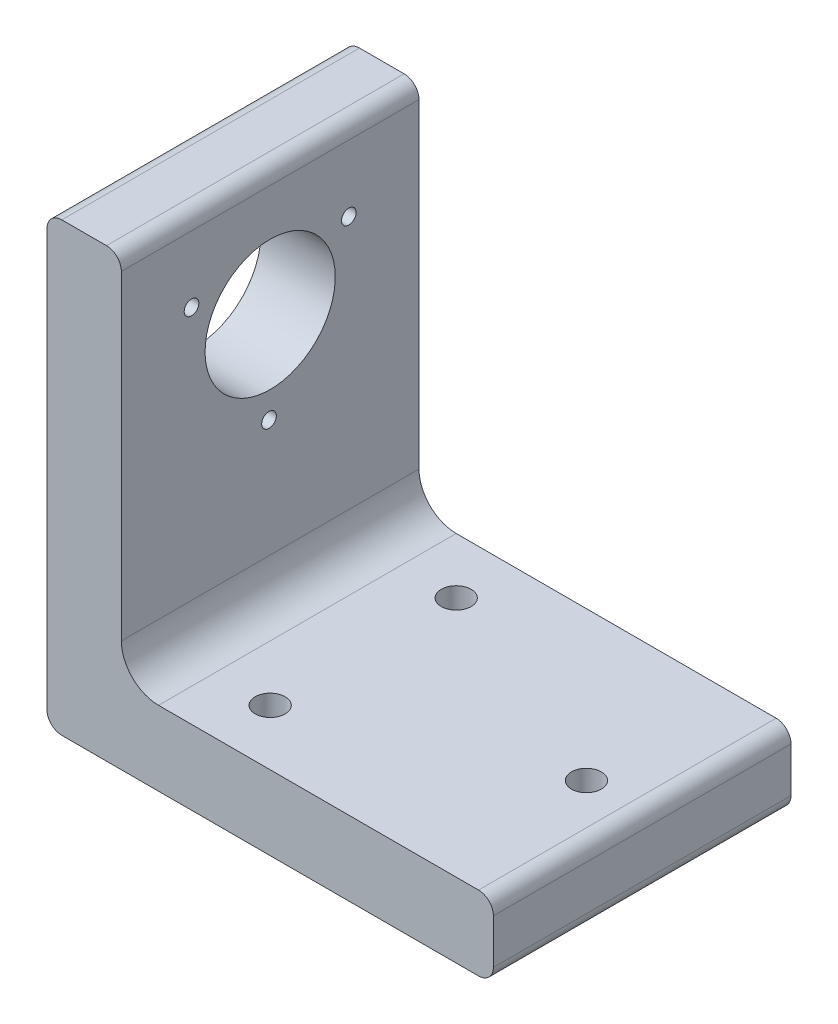
ISO-10303-21;
HEADER;
FILE_DESCRIPTION(('STEP AP214'),'2;1');
FILE_NAME('part.step','',(''),(''),'','','');
FILE_SCHEMA(('AUTOMOTIVE_DESIGN { 1 0 10303 214 1 1 1 1 }'));
ENDSEC;
DATA;
#1=APPLICATION_CONTEXT('core data for automotive mechanical design processes');
#2=APPLICATION_PROTOCOL_DEFINITION('international standard','automotive_design',2000,#1);
#3=PRODUCT_CONTEXT('',#1,'mechanical');
#4=PRODUCT('Part','Part','',(#3));
#5=PRODUCT_RELATED_PRODUCT_CATEGORY('part','',(#4));
#6=PRODUCT_DEFINITION_FORMATION('','',#4);
#7=PRODUCT_DEFINITION_CONTEXT('part definition',#1,'design');
#8=PRODUCT_DEFINITION('design','',#6,#7);
#9=PRODUCT_DEFINITION_SHAPE('','',#8);
#10=(LENGTH_UNIT() NAMED_UNIT(*) SI_UNIT(.MILLI.,.METRE.));
#11=(NAMED_UNIT(*) PLANE_ANGLE_UNIT() SI_UNIT($,.RADIAN.));
#12=(NAMED_UNIT(*) SI_UNIT($,.STERADIAN.) SOLID_ANGLE_UNIT());
#13=UNCERTAINTY_MEASURE_WITH_UNIT(LENGTH_MEASURE(1.E-05),#10,'distance_accuracy_value','');
#14=(GEOMETRIC_REPRESENTATION_CONTEXT(3) GLOBAL_UNCERTAINTY_ASSIGNED_CONTEXT((#13)) GLOBAL_UNIT_ASSIGNED_CONTEXT((#10,
#11,#12)) REPRESENTATION_CONTEXT('',''));
#15=CARTESIAN_POINT('',(0.,0.,0.));
#16=DIRECTION('',(0.,0.,1.));
#17=DIRECTION('',(1.,0.,0.));
#18=AXIS2_PLACEMENT_3D('',#15,#16,#17);
#19=CARTESIAN_POINT('',(12.7,12.7,50.8));
#20=DIRECTION('',(0.,-1.,0.));
#21=DIRECTION('',(1.,0.,0.));
#22=AXIS2_PLACEMENT_3D('',#19,#20,#21);
#23=PLANE('',#22);
#24=DIRECTION('',(-1.,0.,0.));
#25=VECTOR('',#24,1.);
#26=CARTESIAN_POINT('',(12.7,12.7,0.));
#27=LINE('',#26,#25);
#28=CARTESIAN_POINT('',(73.66,12.7,0.));
#29=VERTEX_POINT('',#28);
#30=CARTESIAN_POINT('',(19.05,12.7,0.));
#31=VERTEX_POINT('',#30);
#32=EDGE_CURVE('E169',#29,#31,#27,.T.);
#33=ORIENTED_EDGE('',*,*,#32,.T.);
#34=DIRECTION('',(0.,0.,-1.));
#35=VECTOR('',#34,1.);
#36=CARTESIAN_POINT('',(19.05,12.7,50.8));
#37=LINE('',#36,#35);
#38=CARTESIAN_POINT('',(19.05,12.7,50.8));
#39=VERTEX_POINT('',#38);
#40=EDGE_CURVE('E66',#31,#39,#37,.F.);
#41=ORIENTED_EDGE('',*,*,#40,.T.);
#42=DIRECTION('',(-1.,0.,0.));
#43=VECTOR('',#42,1.);
#44=CARTESIAN_POINT('',(12.7,12.7,50.8));
#45=LINE('',#44,#43);
#46=CARTESIAN_POINT('',(73.66,12.7,50.8));
#47=VERTEX_POINT('',#46);
#48=EDGE_CURVE('E242',#47,#39,#45,.T.);
#49=ORIENTED_EDGE('',*,*,#48,.F.);
#50=DIRECTION('',(0.,0.,-1.));
#51=VECTOR('',#50,1.);
#52=CARTESIAN_POINT('',(73.66,12.7,50.8));
#53=LINE('',#52,#51);
#54=EDGE_CURVE('E224',#47,#29,#53,.T.);
#55=ORIENTED_EDGE('',*,*,#54,.T.);
#56=EDGE_LOOP('',(#33,#41,#49,#55));
#57=FACE_BOUND('',#56,.T.);
#58=CARTESIAN_POINT('',(66.675,12.7,25.4));
#59=DIRECTION('',(0.,1.,0.));
#60=DIRECTION('',(0.,0.,1.));
#61=AXIS2_PLACEMENT_3D('',#58,#59,#60);
#62=CIRCLE('',#61,2.55270000000001);
#63=CARTESIAN_POINT('',(66.675,12.7,27.9527));
#64=VERTEX_POINT('',#63);
#65=EDGE_CURVE('E561',#64,#64,#62,.T.);
#66=ORIENTED_EDGE('',*,*,#65,.F.);
#67=EDGE_LOOP('',(#66));
#68=FACE_BOUND('',#67,.T.);
#69=CARTESIAN_POINT('',(28.575,12.7,41.275));
#70=DIRECTION('',(0.,1.,0.));
#71=DIRECTION('',(0.,0.,1.));
#72=AXIS2_PLACEMENT_3D('',#69,#70,#71);
#73=CIRCLE('',#72,2.5527);
#74=CARTESIAN_POINT('',(28.575,12.7,43.8277));
#75=VERTEX_POINT('',#74);
#76=EDGE_CURVE('E551',#75,#75,#73,.T.);
#77=ORIENTED_EDGE('',*,*,#76,.F.);
#78=EDGE_LOOP('',(#77));
#79=FACE_BOUND('',#78,.T.);
#80=CARTESIAN_POINT('',(28.575,12.7,9.52500000000001));
#81=DIRECTION('',(0.,1.,0.));
#82=DIRECTION('',(0.,0.,1.));
#83=AXIS2_PLACEMENT_3D('',#80,#81,#82);
#84=CIRCLE('',#83,2.5527);
#85=CARTESIAN_POINT('',(28.575,12.7,12.0777));
#86=VERTEX_POINT('',#85);
#87=EDGE_CURVE('E546',#86,#86,#84,.T.);
#88=ORIENTED_EDGE('',*,*,#87,.F.);
#89=EDGE_LOOP('',(#88));
#90=FACE_BOUND('',#89,.T.);
#91=ADVANCED_FACE('F44',(#57,#68,#79,#90),#23,.F.);
#92=CARTESIAN_POINT('',(12.7,76.2,50.8));
#93=DIRECTION('',(-1.,0.,0.));
#94=DIRECTION('',(0.,-1.,0.));
#95=AXIS2_PLACEMENT_3D('',#92,#93,#94);
#96=PLANE('',#95);
#97=CARTESIAN_POINT('',(12.7,62.3600000000001,11.9766062413412));
#98=DIRECTION('',(1.,0.,0.));
#99=DIRECTION('',(0.,0.,-1.));
#100=AXIS2_PLACEMENT_3D('',#97,#98,#99);
#101=CIRCLE('',#100,1.25);
#102=CARTESIAN_POINT('',(12.7,62.3600000000001,10.7266062413412));
#103=VERTEX_POINT('',#102);
#104=EDGE_CURVE('E577',#103,#103,#101,.T.);
#105=ORIENTED_EDGE('',*,*,#104,.F.);
#106=EDGE_LOOP('',(#105));
#107=FACE_BOUND('',#106,.T.);
#108=CARTESIAN_POINT('',(12.7,54.61,25.4));
#109=DIRECTION('',(1.,0.,0.));
#110=DIRECTION('',(0.,1.,0.));
#111=AXIS2_PLACEMENT_3D('',#108,#109,#110);
#112=CIRCLE('',#111,11.1125);
#113=CARTESIAN_POINT('',(12.7,65.7225,25.4));
#114=VERTEX_POINT('',#113);
#115=EDGE_CURVE('E256',#114,#114,#112,.T.);
#116=ORIENTED_EDGE('',*,*,#115,.F.);
#117=EDGE_LOOP('',(#116));
#118=FACE_BOUND('',#117,.T.);
#119=DIRECTION('',(0.,1.,0.));
#120=VECTOR('',#119,1.);
#121=CARTESIAN_POINT('',(12.7,76.2,50.8));
#122=LINE('',#121,#120);
#123=CARTESIAN_POINT('',(12.7,19.05,50.8));
#124=VERTEX_POINT('',#123);
#125=CARTESIAN_POINT('',(12.7,73.66,50.8));
#126=VERTEX_POINT('',#125);
#127=EDGE_CURVE('E239',#124,#126,#122,.T.);
#128=ORIENTED_EDGE('',*,*,#127,.F.);
#129=DIRECTION('',(0.,0.,-1.));
#130=VECTOR('',#129,1.);
#131=CARTESIAN_POINT('',(12.7,19.05,0.));
#132=LINE('',#131,#130);
#133=CARTESIAN_POINT('',(12.7,19.05,0.));
#134=VERTEX_POINT('',#133);
#135=EDGE_CURVE('E228',#124,#134,#132,.T.);
#136=ORIENTED_EDGE('',*,*,#135,.T.);
#137=DIRECTION('',(0.,1.,0.));
#138=VECTOR('',#137,1.);
#139=CARTESIAN_POINT('',(12.7,76.2,0.));
#140=LINE('',#139,#138);
#141=CARTESIAN_POINT('',(12.7,73.66,0.));
#142=VERTEX_POINT('',#141);
#143=EDGE_CURVE('E162',#134,#142,#140,.T.);
#144=ORIENTED_EDGE('',*,*,#143,.T.);
#145=DIRECTION('',(0.,0.,-1.));
#146=VECTOR('',#145,1.);
#147=CARTESIAN_POINT('',(12.7,73.66,50.8));
#148=LINE('',#147,#146);
#149=EDGE_CURVE('E141',#142,#126,#148,.F.);
#150=ORIENTED_EDGE('',*,*,#149,.T.);
#151=EDGE_LOOP('',(#128,#136,#144,#150));
#152=FACE_BOUND('',#151,.T.);
#153=CARTESIAN_POINT('',(12.7,39.1113092810381,25.6014596683332));
#154=DIRECTION('',(1.,0.,0.));
#155=DIRECTION('',(0.,0.,-1.));
#156=AXIS2_PLACEMENT_3D('',#153,#154,#155);
#157=CIRCLE('',#156,1.25);
#158=CARTESIAN_POINT('',(12.7,39.1113092810381,24.3514596683332));
#159=VERTEX_POINT('',#158);
#160=EDGE_CURVE('E585',#159,#159,#157,.T.);
#161=ORIENTED_EDGE('',*,*,#160,.F.);
#162=EDGE_LOOP('',(#161));
#163=FACE_BOUND('',#162,.T.);
#164=CARTESIAN_POINT('',(12.7,62.36,38.8233937586588));
#165=DIRECTION('',(1.,0.,0.));
#166=DIRECTION('',(0.,0.,-1.));
#167=AXIS2_PLACEMENT_3D('',#164,#165,#166);
#168=CIRCLE('',#167,1.25);
#169=CARTESIAN_POINT('',(12.7,62.36,37.5733937586588));
#170=VERTEX_POINT('',#169);
#171=EDGE_CURVE('E569',#170,#170,#168,.T.);
#172=ORIENTED_EDGE('',*,*,#171,.F.);
#173=EDGE_LOOP('',(#172));
#174=FACE_BOUND('',#173,.T.);
#175=ADVANCED_FACE('F276',(#107,#118,#152,#163,#174),#96,.F.);
#176=CARTESIAN_POINT('',(76.2,0.,50.8));
#177=DIRECTION('',(0.,1.,0.));
#178=DIRECTION('',(0.,0.,1.));
#179=AXIS2_PLACEMENT_3D('',#176,#177,#178);
#180=PLANE('',#179);
#181=CARTESIAN_POINT('',(28.575,0.,9.52500000000001));
#182=DIRECTION('',(0.,1.,0.));
#183=DIRECTION('',(0.,0.,1.));
#184=AXIS2_PLACEMENT_3D('',#181,#182,#183);
#185=CIRCLE('',#184,2.5527);
#186=CARTESIAN_POINT('',(28.575,0.,12.0777));
#187=VERTEX_POINT('',#186);
#188=EDGE_CURVE('E543',#187,#187,#185,.T.);
#189=ORIENTED_EDGE('',*,*,#188,.T.);
#190=EDGE_LOOP('',(#189));
#191=FACE_BOUND('',#190,.T.);
#192=CARTESIAN_POINT('',(28.575,0.,41.275));
#193=DIRECTION('',(0.,1.,0.));
#194=DIRECTION('',(0.,0.,1.));
#195=AXIS2_PLACEMENT_3D('',#192,#193,#194);
#196=CIRCLE('',#195,2.5527);
#197=CARTESIAN_POINT('',(28.575,0.,43.8277));
#198=VERTEX_POINT('',#197);
#199=EDGE_CURVE('E557',#198,#198,#196,.T.);
#200=ORIENTED_EDGE('',*,*,#199,.T.);
#201=EDGE_LOOP('',(#200));
#202=FACE_BOUND('',#201,.T.);
#203=CARTESIAN_POINT('',(66.675,0.,25.4));
#204=DIRECTION('',(0.,1.,0.));
#205=DIRECTION('',(0.,0.,1.));
#206=AXIS2_PLACEMENT_3D('',#203,#204,#205);
#207=CIRCLE('',#206,2.5527);
#208=CARTESIAN_POINT('',(66.675,0.,27.9527));
#209=VERTEX_POINT('',#208);
#210=EDGE_CURVE('E565',#209,#209,#207,.T.);
#211=ORIENTED_EDGE('',*,*,#210,.T.);
#212=EDGE_LOOP('',(#211));
#213=FACE_BOUND('',#212,.T.);
#214=DIRECTION('',(1.,0.,0.));
#215=VECTOR('',#214,1.);
#216=CARTESIAN_POINT('',(76.2,0.,50.8));
#217=LINE('',#216,#215);
#218=CARTESIAN_POINT('',(2.54000000000003,0.,50.8));
#219=VERTEX_POINT('',#218);
#220=CARTESIAN_POINT('',(73.66,0.,50.8));
#221=VERTEX_POINT('',#220);
#222=EDGE_CURVE('E167',#219,#221,#217,.T.);
#223=ORIENTED_EDGE('',*,*,#222,.F.);
#224=DIRECTION('',(0.,0.,-1.));
#225=VECTOR('',#224,1.);
#226=CARTESIAN_POINT('',(2.54,0.,50.8));
#227=LINE('',#226,#225);
#228=CARTESIAN_POINT('',(2.54000000000003,0.,0.));
#229=VERTEX_POINT('',#228);
#230=EDGE_CURVE('E213',#219,#229,#227,.T.);
#231=ORIENTED_EDGE('',*,*,#230,.T.);
#232=DIRECTION('',(1.,0.,0.));
#233=VECTOR('',#232,1.);
#234=CARTESIAN_POINT('',(76.2,0.,0.));
#235=LINE('',#234,#233);
#236=CARTESIAN_POINT('',(73.66,0.,0.));
#237=VERTEX_POINT('',#236);
#238=EDGE_CURVE('E259',#229,#237,#235,.T.);
#239=ORIENTED_EDGE('',*,*,#238,.T.);
#240=DIRECTION('',(0.,0.,-1.));
#241=VECTOR('',#240,1.);
#242=CARTESIAN_POINT('',(73.66,0.,50.8));
#243=LINE('',#242,#241);
#244=EDGE_CURVE('E210',#237,#221,#243,.F.);
#245=ORIENTED_EDGE('',*,*,#244,.T.);
#246=EDGE_LOOP('',(#223,#231,#239,#245));
#247=FACE_BOUND('',#246,.T.);
#248=ADVANCED_FACE('F292',(#191,#202,#213,#247),#180,.F.);
#249=CARTESIAN_POINT('',(76.2,12.7,50.8));
#250=DIRECTION('',(-1.,0.,0.));
#251=DIRECTION('',(0.,0.,1.));
#252=AXIS2_PLACEMENT_3D('',#249,#250,#251);
#253=PLANE('',#252);
#254=DIRECTION('',(0.,1.,0.));
#255=VECTOR('',#254,1.);
#256=CARTESIAN_POINT('',(76.2,12.7,50.8));
#257=LINE('',#256,#255);
#258=CARTESIAN_POINT('',(76.2,2.54,50.8));
#259=VERTEX_POINT('',#258);
#260=CARTESIAN_POINT('',(76.2,10.16,50.8));
#261=VERTEX_POINT('',#260);
#262=EDGE_CURVE('E245',#259,#261,#257,.T.);
#263=ORIENTED_EDGE('',*,*,#262,.F.);
#264=DIRECTION('',(0.,0.,-1.));
#265=VECTOR('',#264,1.);
#266=CARTESIAN_POINT('',(76.2,2.54,50.8));
#267=LINE('',#266,#265);
#268=CARTESIAN_POINT('',(76.2,2.54,0.));
#269=VERTEX_POINT('',#268);
#270=EDGE_CURVE('E220',#259,#269,#267,.T.);
#271=ORIENTED_EDGE('',*,*,#270,.T.);
#272=DIRECTION('',(0.,1.,0.));
#273=VECTOR('',#272,1.);
#274=CARTESIAN_POINT('',(76.2,12.7,0.));
#275=LINE('',#274,#273);
#276=CARTESIAN_POINT('',(76.2,10.16,0.));
#277=VERTEX_POINT('',#276);
#278=EDGE_CURVE('E263',#269,#277,#275,.T.);
#279=ORIENTED_EDGE('',*,*,#278,.T.);
#280=DIRECTION('',(0.,0.,-1.));
#281=VECTOR('',#280,1.);
#282=CARTESIAN_POINT('',(76.2,10.16,50.8));
#283=LINE('',#282,#281);
#284=EDGE_CURVE('E217',#277,#261,#283,.F.);
#285=ORIENTED_EDGE('',*,*,#284,.T.);
#286=EDGE_LOOP('',(#263,#271,#279,#285));
#287=FACE_BOUND('',#286,.T.);
#288=ADVANCED_FACE('F300',(#287),#253,.F.);
#289=CARTESIAN_POINT('',(0.,76.2,50.8));
#290=DIRECTION('',(0.,-1.,0.));
#291=DIRECTION('',(0.,0.,-1.));
#292=AXIS2_PLACEMENT_3D('',#289,#290,#291);
#293=PLANE('',#292);
#294=DIRECTION('',(-1.,0.,0.));
#295=VECTOR('',#294,1.);
#296=CARTESIAN_POINT('',(0.,76.2,50.8));
#297=LINE('',#296,#295);
#298=CARTESIAN_POINT('',(10.16,76.2,50.8));
#299=VERTEX_POINT('',#298);
#300=CARTESIAN_POINT('',(2.54,76.2,50.8));
#301=VERTEX_POINT('',#300);
#302=EDGE_CURVE('E153',#299,#301,#297,.T.);
#303=ORIENTED_EDGE('',*,*,#302,.F.);
#304=DIRECTION('',(0.,0.,-1.));
#305=VECTOR('',#304,1.);
#306=CARTESIAN_POINT('',(10.16,76.2,50.8));
#307=LINE('',#306,#305);
#308=CARTESIAN_POINT('',(10.16,76.2,0.));
#309=VERTEX_POINT('',#308);
#310=EDGE_CURVE('E139',#299,#309,#307,.T.);
#311=ORIENTED_EDGE('',*,*,#310,.T.);
#312=DIRECTION('',(-1.,0.,0.));
#313=VECTOR('',#312,1.);
#314=CARTESIAN_POINT('',(0.,76.2,0.));
#315=LINE('',#314,#313);
#316=CARTESIAN_POINT('',(2.54,76.2,0.));
#317=VERTEX_POINT('',#316);
#318=EDGE_CURVE('E150',#309,#317,#315,.T.);
#319=ORIENTED_EDGE('',*,*,#318,.T.);
#320=DIRECTION('',(0.,0.,-1.));
#321=VECTOR('',#320,1.);
#322=CARTESIAN_POINT('',(2.54,76.2,50.8));
#323=LINE('',#322,#321);
#324=EDGE_CURVE('E156',#317,#301,#323,.F.);
#325=ORIENTED_EDGE('',*,*,#324,.T.);
#326=EDGE_LOOP('',(#303,#311,#319,#325));
#327=FACE_BOUND('',#326,.T.);
#328=ADVANCED_FACE('F149',(#327),#293,.F.);
#329=CARTESIAN_POINT('',(0.,0.,50.8));
#330=DIRECTION('',(1.,0.,0.));
#331=DIRECTION('',(0.,0.,-1.));
#332=AXIS2_PLACEMENT_3D('',#329,#330,#331);
#333=PLANE('',#332);
#334=CARTESIAN_POINT('',(0.,62.36,38.8233937586588));
#335=DIRECTION('',(1.,0.,0.));
#336=DIRECTION('',(0.,0.,-1.));
#337=AXIS2_PLACEMENT_3D('',#334,#335,#336);
#338=CIRCLE('',#337,1.25);
#339=CARTESIAN_POINT('',(0.,62.36,37.5733937586588));
#340=VERTEX_POINT('',#339);
#341=EDGE_CURVE('E573',#340,#340,#338,.T.);
#342=ORIENTED_EDGE('',*,*,#341,.T.);
#343=EDGE_LOOP('',(#342));
#344=FACE_BOUND('',#343,.T.);
#345=CARTESIAN_POINT('',(0.,62.3600000000001,11.9766062413412));
#346=DIRECTION('',(1.,0.,0.));
#347=DIRECTION('',(0.,0.,-1.));
#348=AXIS2_PLACEMENT_3D('',#345,#346,#347);
#349=CIRCLE('',#348,1.25);
#350=CARTESIAN_POINT('',(0.,62.3600000000001,10.7266062413412));
#351=VERTEX_POINT('',#350);
#352=EDGE_CURVE('E581',#351,#351,#349,.T.);
#353=ORIENTED_EDGE('',*,*,#352,.T.);
#354=EDGE_LOOP('',(#353));
#355=FACE_BOUND('',#354,.T.);
#356=CARTESIAN_POINT('',(0.,39.1113092810381,25.6014596683332));
#357=DIRECTION('',(1.,0.,0.));
#358=DIRECTION('',(0.,0.,-1.));
#359=AXIS2_PLACEMENT_3D('',#356,#357,#358);
#360=CIRCLE('',#359,1.25);
#361=CARTESIAN_POINT('',(0.,39.1113092810381,24.3514596683332));
#362=VERTEX_POINT('',#361);
#363=EDGE_CURVE('E589',#362,#362,#360,.T.);
#364=ORIENTED_EDGE('',*,*,#363,.T.);
#365=EDGE_LOOP('',(#364));
#366=FACE_BOUND('',#365,.T.);
#367=CARTESIAN_POINT('',(0.,54.61,25.4));
#368=DIRECTION('',(1.,0.,0.));
#369=DIRECTION('',(0.,1.,0.));
#370=AXIS2_PLACEMENT_3D('',#367,#368,#369);
#371=CIRCLE('',#370,11.1125);
#372=CARTESIAN_POINT('',(0.,65.7225,25.4));
#373=VERTEX_POINT('',#372);
#374=EDGE_CURVE('E264',#373,#373,#371,.T.);
#375=ORIENTED_EDGE('',*,*,#374,.T.);
#376=EDGE_LOOP('',(#375));
#377=FACE_BOUND('',#376,.T.);
#378=DIRECTION('',(0.,-1.,0.));
#379=VECTOR('',#378,1.);
#380=CARTESIAN_POINT('',(0.,0.,50.8));
#381=LINE('',#380,#379);
#382=CARTESIAN_POINT('',(0.,73.66,50.8));
#383=VERTEX_POINT('',#382);
#384=CARTESIAN_POINT('',(0.,2.54,50.8));
#385=VERTEX_POINT('',#384);
#386=EDGE_CURVE('E174',#383,#385,#381,.T.);
#387=ORIENTED_EDGE('',*,*,#386,.F.);
#388=DIRECTION('',(0.,0.,-1.));
#389=VECTOR('',#388,1.);
#390=CARTESIAN_POINT('',(0.,73.66,50.8));
#391=LINE('',#390,#389);
#392=CARTESIAN_POINT('',(0.,73.66,0.));
#393=VERTEX_POINT('',#392);
#394=EDGE_CURVE('E206',#383,#393,#391,.T.);
#395=ORIENTED_EDGE('',*,*,#394,.T.);
#396=DIRECTION('',(0.,-1.,0.));
#397=VECTOR('',#396,1.);
#398=CARTESIAN_POINT('',(0.,0.,0.));
#399=LINE('',#398,#397);
#400=CARTESIAN_POINT('',(0.,2.54,0.));
#401=VERTEX_POINT('',#400);
#402=EDGE_CURVE('E161',#393,#401,#399,.T.);
#403=ORIENTED_EDGE('',*,*,#402,.T.);
#404=DIRECTION('',(0.,0.,-1.));
#405=VECTOR('',#404,1.);
#406=CARTESIAN_POINT('',(0.,2.54,50.8));
#407=LINE('',#406,#405);
#408=EDGE_CURVE('E203',#401,#385,#407,.F.);
#409=ORIENTED_EDGE('',*,*,#408,.T.);
#410=EDGE_LOOP('',(#387,#395,#403,#409));
#411=FACE_BOUND('',#410,.T.);
#412=ADVANCED_FACE('F284',(#344,#355,#366,#377,#411),#333,.F.);
#413=CARTESIAN_POINT('',(0.,0.,50.8));
#414=DIRECTION('',(0.,0.,-1.));
#415=DIRECTION('',(-1.,0.,0.));
#416=AXIS2_PLACEMENT_3D('',#413,#414,#415);
#417=PLANE('',#416);
#418=ORIENTED_EDGE('',*,*,#48,.T.);
#419=CARTESIAN_POINT('',(19.05,19.05,50.8));
#420=DIRECTION('',(0.,0.,-1.));
#421=DIRECTION('',(-1.,0.,0.));
#422=AXIS2_PLACEMENT_3D('',#419,#420,#421);
#423=CIRCLE('',#422,6.35);
#424=EDGE_CURVE('E11',#39,#124,#423,.T.);
#425=ORIENTED_EDGE('',*,*,#424,.T.);
#426=ORIENTED_EDGE('',*,*,#127,.T.);
#427=CARTESIAN_POINT('',(10.16,73.66,50.8));
#428=DIRECTION('',(0.,0.,-1.));
#429=DIRECTION('',(-1.,0.,0.));
#430=AXIS2_PLACEMENT_3D('',#427,#428,#429);
#431=CIRCLE('',#430,2.54);
#432=EDGE_CURVE('E200',#126,#299,#431,.F.);
#433=ORIENTED_EDGE('',*,*,#432,.T.);
#434=ORIENTED_EDGE('',*,*,#302,.T.);
#435=CARTESIAN_POINT('',(2.54,73.66,50.8));
#436=DIRECTION('',(0.,0.,-1.));
#437=DIRECTION('',(-1.,0.,0.));
#438=AXIS2_PLACEMENT_3D('',#435,#436,#437);
#439=CIRCLE('',#438,2.54);
#440=EDGE_CURVE('E197',#301,#383,#439,.F.);
#441=ORIENTED_EDGE('',*,*,#440,.T.);
#442=ORIENTED_EDGE('',*,*,#386,.T.);
#443=CARTESIAN_POINT('',(2.54,2.54,50.8));
#444=DIRECTION('',(0.,0.,-1.));
#445=DIRECTION('',(-1.,0.,0.));
#446=AXIS2_PLACEMENT_3D('',#443,#444,#445);
#447=CIRCLE('',#446,2.54);
#448=EDGE_CURVE('E194',#385,#219,#447,.F.);
#449=ORIENTED_EDGE('',*,*,#448,.T.);
#450=ORIENTED_EDGE('',*,*,#222,.T.);
#451=CARTESIAN_POINT('',(73.66,2.54,50.8));
#452=DIRECTION('',(0.,0.,-1.));
#453=DIRECTION('',(-1.,0.,0.));
#454=AXIS2_PLACEMENT_3D('',#451,#452,#453);
#455=CIRCLE('',#454,2.54);
#456=EDGE_CURVE('E191',#221,#259,#455,.F.);
#457=ORIENTED_EDGE('',*,*,#456,.T.);
#458=ORIENTED_EDGE('',*,*,#262,.T.);
#459=CARTESIAN_POINT('',(73.66,10.16,50.8));
#460=DIRECTION('',(0.,0.,-1.));
#461=DIRECTION('',(-1.,0.,0.));
#462=AXIS2_PLACEMENT_3D('',#459,#460,#461);
#463=CIRCLE('',#462,2.54);
#464=EDGE_CURVE('E188',#261,#47,#463,.F.);
#465=ORIENTED_EDGE('',*,*,#464,.T.);
#466=EDGE_LOOP('',(#418,#425,#426,#433,#434,#441,#442,#449,#450,#457,#458,#465));
#467=FACE_BOUND('',#466,.T.);
#468=ADVANCED_FACE('F274',(#467),#417,.F.);
#469=CARTESIAN_POINT('',(0.,0.,0.));
#470=DIRECTION('',(0.,0.,-1.));
#471=DIRECTION('',(-1.,0.,0.));
#472=AXIS2_PLACEMENT_3D('',#469,#470,#471);
#473=PLANE('',#472);
#474=ORIENTED_EDGE('',*,*,#318,.F.);
#475=CARTESIAN_POINT('',(10.16,73.66,0.));
#476=DIRECTION('',(0.,0.,-1.));
#477=DIRECTION('',(-1.,0.,0.));
#478=AXIS2_PLACEMENT_3D('',#475,#476,#477);
#479=CIRCLE('',#478,2.54);
#480=EDGE_CURVE('E135',#309,#142,#479,.T.);
#481=ORIENTED_EDGE('',*,*,#480,.T.);
#482=ORIENTED_EDGE('',*,*,#143,.F.);
#483=CARTESIAN_POINT('',(19.05,19.05,0.));
#484=DIRECTION('',(0.,0.,-1.));
#485=DIRECTION('',(-1.,0.,0.));
#486=AXIS2_PLACEMENT_3D('',#483,#484,#485);
#487=CIRCLE('',#486,6.35);
#488=EDGE_CURVE('E53',#134,#31,#487,.F.);
#489=ORIENTED_EDGE('',*,*,#488,.T.);
#490=ORIENTED_EDGE('',*,*,#32,.F.);
#491=CARTESIAN_POINT('',(73.66,10.16,0.));
#492=DIRECTION('',(0.,0.,-1.));
#493=DIRECTION('',(-1.,0.,0.));
#494=AXIS2_PLACEMENT_3D('',#491,#492,#493);
#495=CIRCLE('',#494,2.54);
#496=EDGE_CURVE('E155',#29,#277,#495,.T.);
#497=ORIENTED_EDGE('',*,*,#496,.T.);
#498=ORIENTED_EDGE('',*,*,#278,.F.);
#499=CARTESIAN_POINT('',(73.66,2.54,0.));
#500=DIRECTION('',(0.,0.,-1.));
#501=DIRECTION('',(-1.,0.,0.));
#502=AXIS2_PLACEMENT_3D('',#499,#500,#501);
#503=CIRCLE('',#502,2.54);
#504=EDGE_CURVE('E178',#269,#237,#503,.T.);
#505=ORIENTED_EDGE('',*,*,#504,.T.);
#506=ORIENTED_EDGE('',*,*,#238,.F.);
#507=CARTESIAN_POINT('',(2.54,2.54,0.));
#508=DIRECTION('',(0.,0.,-1.));
#509=DIRECTION('',(-1.,0.,0.));
#510=AXIS2_PLACEMENT_3D('',#507,#508,#509);
#511=CIRCLE('',#510,2.54);
#512=EDGE_CURVE('E181',#229,#401,#511,.T.);
#513=ORIENTED_EDGE('',*,*,#512,.T.);
#514=ORIENTED_EDGE('',*,*,#402,.F.);
#515=CARTESIAN_POINT('',(2.54,73.66,0.));
#516=DIRECTION('',(0.,0.,-1.));
#517=DIRECTION('',(-1.,0.,0.));
#518=AXIS2_PLACEMENT_3D('',#515,#516,#517);
#519=CIRCLE('',#518,2.54);
#520=EDGE_CURVE('E144',#393,#317,#519,.T.);
#521=ORIENTED_EDGE('',*,*,#520,.T.);
#522=EDGE_LOOP('',(#474,#481,#482,#489,#490,#497,#498,#505,#506,#513,#514,#521));
#523=FACE_BOUND('',#522,.T.);
#524=ADVANCED_FACE('F158',(#523),#473,.T.);
#525=CARTESIAN_POINT('',(10.16,73.66,50.8));
#526=DIRECTION('',(0.,0.,-1.));
#527=DIRECTION('',(-1.,0.,0.));
#528=AXIS2_PLACEMENT_3D('',#525,#526,#527);
#529=CYLINDRICAL_SURFACE('',#528,2.54);
#530=ORIENTED_EDGE('',*,*,#432,.F.);
#531=ORIENTED_EDGE('',*,*,#149,.F.);
#532=ORIENTED_EDGE('',*,*,#480,.F.);
#533=ORIENTED_EDGE('',*,*,#310,.F.);
#534=EDGE_LOOP('',(#530,#531,#532,#533));
#535=FACE_BOUND('',#534,.T.);
#536=ADVANCED_FACE('F138',(#535),#529,.T.);
#537=CARTESIAN_POINT('',(2.54,73.66,50.8));
#538=DIRECTION('',(0.,0.,-1.));
#539=DIRECTION('',(-1.,0.,0.));
#540=AXIS2_PLACEMENT_3D('',#537,#538,#539);
#541=CYLINDRICAL_SURFACE('',#540,2.54);
#542=ORIENTED_EDGE('',*,*,#440,.F.);
#543=ORIENTED_EDGE('',*,*,#324,.F.);
#544=ORIENTED_EDGE('',*,*,#520,.F.);
#545=ORIENTED_EDGE('',*,*,#394,.F.);
#546=EDGE_LOOP('',(#542,#543,#544,#545));
#547=FACE_BOUND('',#546,.T.);
#548=ADVANCED_FACE('F282',(#547),#541,.T.);
#549=CARTESIAN_POINT('',(2.54,2.54,50.8));
#550=DIRECTION('',(0.,0.,-1.));
#551=DIRECTION('',(-1.,0.,0.));
#552=AXIS2_PLACEMENT_3D('',#549,#550,#551);
#553=CYLINDRICAL_SURFACE('',#552,2.54);
#554=ORIENTED_EDGE('',*,*,#448,.F.);
#555=ORIENTED_EDGE('',*,*,#408,.F.);
#556=ORIENTED_EDGE('',*,*,#512,.F.);
#557=ORIENTED_EDGE('',*,*,#230,.F.);
#558=EDGE_LOOP('',(#554,#555,#556,#557));
#559=FACE_BOUND('',#558,.T.);
#560=ADVANCED_FACE('F290',(#559),#553,.T.);
#561=CARTESIAN_POINT('',(73.66,2.54,50.8));
#562=DIRECTION('',(0.,0.,-1.));
#563=DIRECTION('',(-1.,0.,0.));
#564=AXIS2_PLACEMENT_3D('',#561,#562,#563);
#565=CYLINDRICAL_SURFACE('',#564,2.54);
#566=ORIENTED_EDGE('',*,*,#456,.F.);
#567=ORIENTED_EDGE('',*,*,#244,.F.);
#568=ORIENTED_EDGE('',*,*,#504,.F.);
#569=ORIENTED_EDGE('',*,*,#270,.F.);
#570=EDGE_LOOP('',(#566,#567,#568,#569));
#571=FACE_BOUND('',#570,.T.);
#572=ADVANCED_FACE('F295',(#571),#565,.T.);
#573=CARTESIAN_POINT('',(73.66,10.16,50.8));
#574=DIRECTION('',(0.,0.,-1.));
#575=DIRECTION('',(-1.,0.,0.));
#576=AXIS2_PLACEMENT_3D('',#573,#574,#575);
#577=CYLINDRICAL_SURFACE('',#576,2.54);
#578=ORIENTED_EDGE('',*,*,#464,.F.);
#579=ORIENTED_EDGE('',*,*,#284,.F.);
#580=ORIENTED_EDGE('',*,*,#496,.F.);
#581=ORIENTED_EDGE('',*,*,#54,.F.);
#582=EDGE_LOOP('',(#578,#579,#580,#581));
#583=FACE_BOUND('',#582,.T.);
#584=ADVANCED_FACE('F304',(#583),#577,.T.);
#585=CARTESIAN_POINT('',(19.05,19.05,50.8));
#586=DIRECTION('',(0.,0.,1.));
#587=DIRECTION('',(1.,0.,0.));
#588=AXIS2_PLACEMENT_3D('',#585,#586,#587);
#589=CYLINDRICAL_SURFACE('',#588,6.35);
#590=ORIENTED_EDGE('',*,*,#424,.F.);
#591=ORIENTED_EDGE('',*,*,#40,.F.);
#592=ORIENTED_EDGE('',*,*,#488,.F.);
#593=ORIENTED_EDGE('',*,*,#135,.F.);
#594=EDGE_LOOP('',(#590,#591,#592,#593));
#595=FACE_BOUND('',#594,.T.);
#596=ADVANCED_FACE('F46',(#595),#589,.F.);
#597=CARTESIAN_POINT('',(0.,54.61,25.4));
#598=DIRECTION('',(1.,0.,0.));
#599=DIRECTION('',(0.,1.,0.));
#600=AXIS2_PLACEMENT_3D('',#597,#598,#599);
#601=CYLINDRICAL_SURFACE('',#600,11.1125);
#602=ORIENTED_EDGE('',*,*,#374,.F.);
#603=EDGE_LOOP('',(#602));
#604=FACE_BOUND('',#603,.T.);
#605=ORIENTED_EDGE('',*,*,#115,.T.);
#606=EDGE_LOOP('',(#605));
#607=FACE_BOUND('',#606,.T.);
#608=ADVANCED_FACE('F310',(#604,#607),#601,.F.);
#609=CARTESIAN_POINT('',(12.7,39.1113092810381,25.6014596683332));
#610=DIRECTION('',(1.,0.,0.));
#611=DIRECTION('',(0.,0.,-1.));
#612=AXIS2_PLACEMENT_3D('',#609,#610,#611);
#613=CYLINDRICAL_SURFACE('',#612,1.25);
#614=ORIENTED_EDGE('',*,*,#363,.F.);
#615=EDGE_LOOP('',(#614));
#616=FACE_BOUND('',#615,.T.);
#617=ORIENTED_EDGE('',*,*,#160,.T.);
#618=EDGE_LOOP('',(#617));
#619=FACE_BOUND('',#618,.T.);
#620=ADVANCED_FACE('F382',(#616,#619),#613,.F.);
#621=CARTESIAN_POINT('',(12.7,62.3600000000001,11.9766062413412));
#622=DIRECTION('',(1.,0.,0.));
#623=DIRECTION('',(0.,0.,-1.));
#624=AXIS2_PLACEMENT_3D('',#621,#622,#623);
#625=CYLINDRICAL_SURFACE('',#624,1.25);
#626=ORIENTED_EDGE('',*,*,#352,.F.);
#627=EDGE_LOOP('',(#626));
#628=FACE_BOUND('',#627,.T.);
#629=ORIENTED_EDGE('',*,*,#104,.T.);
#630=EDGE_LOOP('',(#629));
#631=FACE_BOUND('',#630,.T.);
#632=ADVANCED_FACE('F411',(#628,#631),#625,.F.);
#633=CARTESIAN_POINT('',(12.7,62.36,38.8233937586588));
#634=DIRECTION('',(1.,0.,0.));
#635=DIRECTION('',(0.,0.,-1.));
#636=AXIS2_PLACEMENT_3D('',#633,#634,#635);
#637=CYLINDRICAL_SURFACE('',#636,1.25);
#638=ORIENTED_EDGE('',*,*,#341,.F.);
#639=EDGE_LOOP('',(#638));
#640=FACE_BOUND('',#639,.T.);
#641=ORIENTED_EDGE('',*,*,#171,.T.);
#642=EDGE_LOOP('',(#641));
#643=FACE_BOUND('',#642,.T.);
#644=ADVANCED_FACE('F423',(#640,#643),#637,.F.);
#645=CARTESIAN_POINT('',(66.675,12.7,25.4));
#646=DIRECTION('',(0.,1.,0.));
#647=DIRECTION('',(0.,0.,1.));
#648=AXIS2_PLACEMENT_3D('',#645,#646,#647);
#649=CYLINDRICAL_SURFACE('',#648,2.5527);
#650=ORIENTED_EDGE('',*,*,#210,.F.);
#651=EDGE_LOOP('',(#650));
#652=FACE_BOUND('',#651,.T.);
#653=ORIENTED_EDGE('',*,*,#65,.T.);
#654=EDGE_LOOP('',(#653));
#655=FACE_BOUND('',#654,.T.);
#656=ADVANCED_FACE('F434',(#652,#655),#649,.F.);
#657=CARTESIAN_POINT('',(28.575,12.7,41.275));
#658=DIRECTION('',(0.,1.,0.));
#659=DIRECTION('',(0.,0.,1.));
#660=AXIS2_PLACEMENT_3D('',#657,#658,#659);
#661=CYLINDRICAL_SURFACE('',#660,2.5527);
#662=ORIENTED_EDGE('',*,*,#199,.F.);
#663=EDGE_LOOP('',(#662));
#664=FACE_BOUND('',#663,.T.);
#665=ORIENTED_EDGE('',*,*,#76,.T.);
#666=EDGE_LOOP('',(#665));
#667=FACE_BOUND('',#666,.T.);
#668=ADVANCED_FACE('F460',(#664,#667),#661,.F.);
#669=CARTESIAN_POINT('',(28.575,12.7,9.52500000000001));
#670=DIRECTION('',(0.,1.,0.));
#671=DIRECTION('',(0.,0.,1.));
#672=AXIS2_PLACEMENT_3D('',#669,#670,#671);
#673=CYLINDRICAL_SURFACE('',#672,2.5527);
#674=ORIENTED_EDGE('',*,*,#188,.F.);
#675=EDGE_LOOP('',(#674));
#676=FACE_BOUND('',#675,.T.);
#677=ORIENTED_EDGE('',*,*,#87,.T.);
#678=EDGE_LOOP('',(#677));
#679=FACE_BOUND('',#678,.T.);
#680=ADVANCED_FACE('F471',(#676,#679),#673,.F.);
#681=CLOSED_SHELL('',(#91,#175,#248,#288,#328,#412,#468,#524,#536,#548,#560,#572,#584,#596,#608,
#620,#632,#644,#656,#668,#680));
#682=MANIFOLD_SOLID_BREP('B2',#681);
#683=ADVANCED_BREP_SHAPE_REPRESENTATION('',(#18,#682),#14);
#684=SHAPE_DEFINITION_REPRESENTATION(#9,#683);
ENDSEC;
END-ISO-10303-21;
